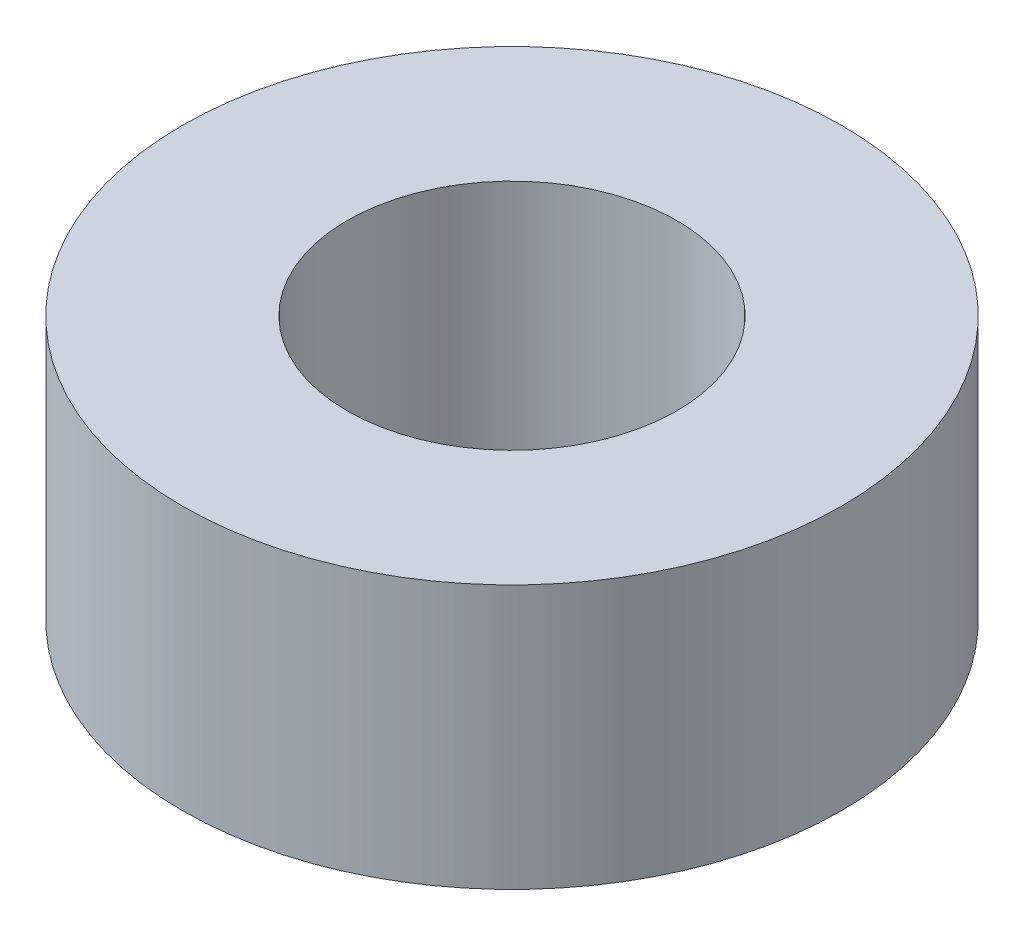
ISO-10303-21;
HEADER;
FILE_DESCRIPTION(('STEP AP214'),'2;1');
FILE_NAME('part.step','',(''),(''),'','','');
FILE_SCHEMA(('AUTOMOTIVE_DESIGN { 1 0 10303 214 1 1 1 1 }'));
ENDSEC;
DATA;
#1=APPLICATION_CONTEXT('core data for automotive mechanical design processes');
#2=APPLICATION_PROTOCOL_DEFINITION('international standard','automotive_design',2000,#1);
#3=PRODUCT_CONTEXT('',#1,'mechanical');
#4=PRODUCT('Part','Part','',(#3));
#5=PRODUCT_RELATED_PRODUCT_CATEGORY('part','',(#4));
#6=PRODUCT_DEFINITION_FORMATION('','',#4);
#7=PRODUCT_DEFINITION_CONTEXT('part definition',#1,'design');
#8=PRODUCT_DEFINITION('design','',#6,#7);
#9=PRODUCT_DEFINITION_SHAPE('','',#8);
#10=(LENGTH_UNIT() NAMED_UNIT(*) SI_UNIT(.MILLI.,.METRE.));
#11=(NAMED_UNIT(*) PLANE_ANGLE_UNIT() SI_UNIT($,.RADIAN.));
#12=(NAMED_UNIT(*) SI_UNIT($,.STERADIAN.) SOLID_ANGLE_UNIT());
#13=UNCERTAINTY_MEASURE_WITH_UNIT(LENGTH_MEASURE(1.E-05),#10,'distance_accuracy_value','');
#14=(GEOMETRIC_REPRESENTATION_CONTEXT(3) GLOBAL_UNCERTAINTY_ASSIGNED_CONTEXT((#13)) GLOBAL_UNIT_ASSIGNED_CONTEXT((#10,
#11,#12)) REPRESENTATION_CONTEXT('',''));
#15=CARTESIAN_POINT('',(0.,0.,0.));
#16=DIRECTION('',(0.,0.,1.));
#17=DIRECTION('',(1.,0.,0.));
#18=AXIS2_PLACEMENT_3D('',#15,#16,#17);
#19=CARTESIAN_POINT('',(0.,4.,0.));
#20=DIRECTION('',(0.,1.,0.));
#21=DIRECTION('',(0.,0.,1.));
#22=AXIS2_PLACEMENT_3D('',#19,#20,#21);
#23=PLANE('',#22);
#24=CARTESIAN_POINT('',(0.,4.,0.));
#25=DIRECTION('',(0.,1.,0.));
#26=DIRECTION('',(0.,0.,1.));
#27=AXIS2_PLACEMENT_3D('',#24,#25,#26);
#28=CIRCLE('',#27,5.);
#29=CARTESIAN_POINT('',(0.,4.,5.));
#30=VERTEX_POINT('',#29);
#31=EDGE_CURVE('E10',#30,#30,#28,.T.);
#32=ORIENTED_EDGE('',*,*,#31,.T.);
#33=EDGE_LOOP('',(#32));
#34=FACE_BOUND('',#33,.T.);
#35=CARTESIAN_POINT('',(0.,4.,0.));
#36=DIRECTION('',(0.,1.,0.));
#37=DIRECTION('',(0.,0.,1.));
#38=AXIS2_PLACEMENT_3D('',#35,#36,#37);
#39=CIRCLE('',#38,2.5);
#40=CARTESIAN_POINT('',(0.,4.,2.5));
#41=VERTEX_POINT('',#40);
#42=EDGE_CURVE('E46',#41,#41,#39,.T.);
#43=ORIENTED_EDGE('',*,*,#42,.F.);
#44=EDGE_LOOP('',(#43));
#45=FACE_BOUND('',#44,.T.);
#46=ADVANCED_FACE('F35',(#34,#45),#23,.T.);
#47=CARTESIAN_POINT('',(0.,0.,0.));
#48=DIRECTION('',(0.,1.,0.));
#49=DIRECTION('',(0.,0.,1.));
#50=AXIS2_PLACEMENT_3D('',#47,#48,#49);
#51=PLANE('',#50);
#52=CARTESIAN_POINT('',(0.,0.,0.));
#53=DIRECTION('',(0.,1.,0.));
#54=DIRECTION('',(0.,0.,1.));
#55=AXIS2_PLACEMENT_3D('',#52,#53,#54);
#56=CIRCLE('',#55,5.);
#57=CARTESIAN_POINT('',(0.,0.,5.));
#58=VERTEX_POINT('',#57);
#59=EDGE_CURVE('E39',#58,#58,#56,.T.);
#60=ORIENTED_EDGE('',*,*,#59,.F.);
#61=EDGE_LOOP('',(#60));
#62=FACE_BOUND('',#61,.T.);
#63=CARTESIAN_POINT('',(0.,0.,0.));
#64=DIRECTION('',(0.,1.,0.));
#65=DIRECTION('',(0.,0.,1.));
#66=AXIS2_PLACEMENT_3D('',#63,#64,#65);
#67=CIRCLE('',#66,2.5);
#68=CARTESIAN_POINT('',(0.,0.,2.5));
#69=VERTEX_POINT('',#68);
#70=EDGE_CURVE('E48',#69,#69,#67,.T.);
#71=ORIENTED_EDGE('',*,*,#70,.T.);
#72=EDGE_LOOP('',(#71));
#73=FACE_BOUND('',#72,.T.);
#74=ADVANCED_FACE('F58',(#62,#73),#51,.F.);
#75=CARTESIAN_POINT('',(0.,4.,0.));
#76=DIRECTION('',(0.,-1.,0.));
#77=DIRECTION('',(0.,0.,-1.));
#78=AXIS2_PLACEMENT_3D('',#75,#76,#77);
#79=CYLINDRICAL_SURFACE('',#78,5.);
#80=ORIENTED_EDGE('',*,*,#31,.F.);
#81=EDGE_LOOP('',(#80));
#82=FACE_BOUND('',#81,.T.);
#83=ORIENTED_EDGE('',*,*,#59,.T.);
#84=EDGE_LOOP('',(#83));
#85=FACE_BOUND('',#84,.T.);
#86=ADVANCED_FACE('F37',(#82,#85),#79,.T.);
#87=CARTESIAN_POINT('',(0.,4.,0.));
#88=DIRECTION('',(0.,-1.,0.));
#89=DIRECTION('',(0.,0.,-1.));
#90=AXIS2_PLACEMENT_3D('',#87,#88,#89);
#91=CYLINDRICAL_SURFACE('',#90,2.5);
#92=ORIENTED_EDGE('',*,*,#42,.T.);
#93=EDGE_LOOP('',(#92));
#94=FACE_BOUND('',#93,.T.);
#95=ORIENTED_EDGE('',*,*,#70,.F.);
#96=EDGE_LOOP('',(#95));
#97=FACE_BOUND('',#96,.T.);
#98=ADVANCED_FACE('F54',(#94,#97),#91,.F.);
#99=CLOSED_SHELL('',(#46,#74,#86,#98));
#100=MANIFOLD_SOLID_BREP('B2',#99);
#101=ADVANCED_BREP_SHAPE_REPRESENTATION('',(#18,#100),#14);
#102=SHAPE_DEFINITION_REPRESENTATION(#9,#101);
ENDSEC;
END-ISO-10303-21;
